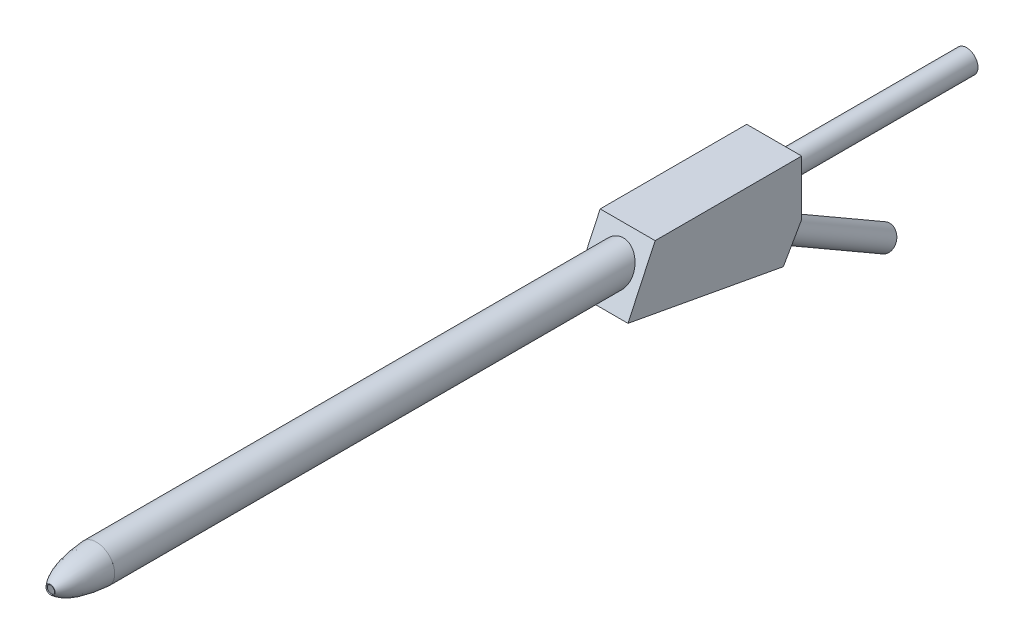
ISO-10303-21;
HEADER;
FILE_DESCRIPTION(('STEP AP214'),'2;1');
FILE_NAME('part.step','',(''),(''),'','','');
FILE_SCHEMA(('AUTOMOTIVE_DESIGN { 1 0 10303 214 1 1 1 1 }'));
ENDSEC;
DATA;
#1=APPLICATION_CONTEXT('core data for automotive mechanical design processes');
#2=APPLICATION_PROTOCOL_DEFINITION('international standard','automotive_design',2000,#1);
#3=PRODUCT_CONTEXT('',#1,'mechanical');
#4=PRODUCT('Part','Part','',(#3));
#5=PRODUCT_RELATED_PRODUCT_CATEGORY('part','',(#4));
#6=PRODUCT_DEFINITION_FORMATION('','',#4);
#7=PRODUCT_DEFINITION_CONTEXT('part definition',#1,'design');
#8=PRODUCT_DEFINITION('design','',#6,#7);
#9=PRODUCT_DEFINITION_SHAPE('','',#8);
#10=(LENGTH_UNIT() NAMED_UNIT(*) SI_UNIT(.MILLI.,.METRE.));
#11=(NAMED_UNIT(*) PLANE_ANGLE_UNIT() SI_UNIT($,.RADIAN.));
#12=(NAMED_UNIT(*) SI_UNIT($,.STERADIAN.) SOLID_ANGLE_UNIT());
#13=UNCERTAINTY_MEASURE_WITH_UNIT(LENGTH_MEASURE(1.E-05),#10,'distance_accuracy_value','');
#14=(GEOMETRIC_REPRESENTATION_CONTEXT(3) GLOBAL_UNCERTAINTY_ASSIGNED_CONTEXT((#13)) GLOBAL_UNIT_ASSIGNED_CONTEXT((#10,
#11,#12)) REPRESENTATION_CONTEXT('',''));
#15=CARTESIAN_POINT('',(0.,0.,0.));
#16=DIRECTION('',(0.,0.,1.));
#17=DIRECTION('',(1.,0.,0.));
#18=AXIS2_PLACEMENT_3D('',#15,#16,#17);
#19=CARTESIAN_POINT('',(3.,-0.999999999999999,58.));
#20=CARTESIAN_POINT('',(3.,-1.21062408025252,61.5822714163661));
#21=CARTESIAN_POINT('',(3.,-2.5,63.));
#22=B_SPLINE_CURVE_WITH_KNOTS('',2,(#19,#20,#21),.UNSPECIFIED.,.F.,.F.,(3,3),(0.,1.),.UNSPECIFIED.);
#23=CARTESIAN_POINT('',(3.,-3.,58.));
#24=DIRECTION('',(0.,0.,-1.));
#25=AXIS1_PLACEMENT('',#23,#24);
#26=SURFACE_OF_REVOLUTION('',#22,#25);
#27=CARTESIAN_POINT('',(3.,-3.,63.));
#28=DIRECTION('',(0.,0.,-1.));
#29=DIRECTION('',(-1.,0.,0.));
#30=AXIS2_PLACEMENT_3D('',#27,#28,#29);
#31=CIRCLE('',#30,0.499999999999995);
#32=CARTESIAN_POINT('',(2.50000000000001,-3.,63.));
#33=VERTEX_POINT('',#32);
#34=EDGE_CURVE('E59',#33,#33,#31,.T.);
#35=ORIENTED_EDGE('',*,*,#34,.T.);
#36=EDGE_LOOP('',(#35));
#37=FACE_BOUND('',#36,.T.);
#38=CARTESIAN_POINT('',(3.,-3.,58.));
#39=DIRECTION('',(0.,0.,-1.));
#40=DIRECTION('',(-1.,0.,0.));
#41=AXIS2_PLACEMENT_3D('',#38,#39,#40);
#42=CIRCLE('',#41,2.);
#43=CARTESIAN_POINT('',(1.,-3.,58.));
#44=VERTEX_POINT('',#43);
#45=EDGE_CURVE('E11',#44,#44,#42,.T.);
#46=ORIENTED_EDGE('',*,*,#45,.F.);
#47=EDGE_LOOP('',(#46));
#48=FACE_BOUND('',#47,.T.);
#49=ADVANCED_FACE('F44',(#37,#48),#26,.F.);
#50=CARTESIAN_POINT('',(3.,-3.,57.9941305129186));
#51=DIRECTION('',(0.,0.,1.));
#52=DIRECTION('',(1.,0.,0.));
#53=AXIS2_PLACEMENT_3D('',#50,#51,#52);
#54=CONICAL_SURFACE('',#53,1.90017240300698,1.51206770212846);
#55=ORIENTED_EDGE('',*,*,#45,.T.);
#56=EDGE_LOOP('',(#55));
#57=FACE_BOUND('',#56,.T.);
#58=CARTESIAN_POINT('',(3.,-3.,57.9941305129186));
#59=DIRECTION('',(0.,0.,-1.));
#60=DIRECTION('',(-1.,0.,0.));
#61=AXIS2_PLACEMENT_3D('',#58,#59,#60);
#62=CIRCLE('',#61,1.90017240300698);
#63=CARTESIAN_POINT('',(1.09982759699302,-3.,57.9941305129186));
#64=VERTEX_POINT('',#63);
#65=EDGE_CURVE('E51',#64,#64,#62,.T.);
#66=ORIENTED_EDGE('',*,*,#65,.F.);
#67=EDGE_LOOP('',(#66));
#68=FACE_BOUND('',#67,.T.);
#69=ADVANCED_FACE('F78',(#57,#68),#54,.T.);
#70=CARTESIAN_POINT('',(3.,-2.573980194543,62.9327175296576));
#71=CARTESIAN_POINT('',(3.,-2.46627954922995,62.8142956784367));
#72=CARTESIAN_POINT('',(3.,-2.27345307077501,62.5684660505644));
#73=CARTESIAN_POINT('',(3.,-1.91662617538266,61.9714709641916));
#74=CARTESIAN_POINT('',(3.,-1.55463473977893,61.0596020998911));
#75=CARTESIAN_POINT('',(3.,-1.29994294852241,59.9117273342673));
#76=CARTESIAN_POINT('',(3.,-1.16370473209703,58.8677243323532));
#77=CARTESIAN_POINT('',(3.,-1.11665394828164,58.2803112629576));
#78=CARTESIAN_POINT('',(3.,-1.09982759699302,57.9941305129186));
#79=B_SPLINE_CURVE_WITH_KNOTS('',3,(#70,#71,#72,#73,#74,#75,#76,#77,#78),.UNSPECIFIED.,.F.,.F.,
(4,1,1,1,1,1,4),(0.,0.125,0.25,0.5,0.75,0.875,1.),.UNSPECIFIED.);
#80=CARTESIAN_POINT('',(3.,-3.,58.));
#81=DIRECTION('',(0.,0.,-1.));
#82=AXIS1_PLACEMENT('',#80,#81);
#83=SURFACE_OF_REVOLUTION('',#79,#82);
#84=ORIENTED_EDGE('',*,*,#65,.T.);
#85=EDGE_LOOP('',(#84));
#86=FACE_BOUND('',#85,.T.);
#87=CARTESIAN_POINT('',(3.,-3.,62.9327175296576));
#88=DIRECTION('',(0.,0.,-1.));
#89=DIRECTION('',(-1.,0.,0.));
#90=AXIS2_PLACEMENT_3D('',#87,#88,#89);
#91=CIRCLE('',#90,0.426019805457004);
#92=CARTESIAN_POINT('',(2.573980194543,-3.,62.9327175296576));
#93=VERTEX_POINT('',#92);
#94=EDGE_CURVE('E55',#93,#93,#91,.T.);
#95=ORIENTED_EDGE('',*,*,#94,.F.);
#96=EDGE_LOOP('',(#95));
#97=FACE_BOUND('',#96,.T.);
#98=ADVANCED_FACE('F74',(#86,#97),#83,.F.);
#99=CARTESIAN_POINT('',(3.,-3.,62.9641776007428));
#100=DIRECTION('',(0.,0.,-1.));
#101=DIRECTION('',(-1.,0.,0.));
#102=AXIS2_PLACEMENT_3D('',#99,#100,#101);
#103=TOROIDAL_SURFACE('',#102,0.464993597267716,0.0500868497791062);
#104=ORIENTED_EDGE('',*,*,#94,.T.);
#105=EDGE_LOOP('',(#104));
#106=FACE_BOUND('',#105,.T.);
#107=ORIENTED_EDGE('',*,*,#34,.F.);
#108=EDGE_LOOP('',(#107));
#109=FACE_BOUND('',#108,.T.);
#110=ADVANCED_FACE('F77',(#106,#109),#103,.T.);
#111=CLOSED_SHELL('',(#49,#69,#98,#110));
#112=MANIFOLD_SOLID_BREP('B2',#111);
#113=CARTESIAN_POINT('',(6.,0.,0.));
#114=DIRECTION('',(0.,-0.423091587311075,-0.906086921187253));
#115=DIRECTION('',(0.,0.906086921187253,-0.423091587311075));
#116=AXIS2_PLACEMENT_3D('',#113,#114,#115);
#117=PLANE('',#116);
#118=CARTESIAN_POINT('',(3.,-3.,1.40083112585941));
#119=DIRECTION('',(0.,-0.423091587311075,-0.906086921187253));
#120=DIRECTION('',(0.,0.906086921187253,-0.423091587311075));
#121=AXIS2_PLACEMENT_3D('',#118,#119,#120);
#122=ELLIPSE('',#121,2.20729375210425,2.);
#123=CARTESIAN_POINT('',(3.,-0.999999999999999,0.466943708619805));
#124=VERTEX_POINT('',#123);
#125=EDGE_CURVE('E210',#124,#124,#122,.F.);
#126=ORIENTED_EDGE('',*,*,#125,.F.);
#127=EDGE_LOOP('',(#126));
#128=FACE_BOUND('',#127,.T.);
#129=DIRECTION('',(0.,-0.906086921187253,0.423091587311075));
#130=VECTOR('',#129,1.);
#131=CARTESIAN_POINT('',(0.,0.,0.));
#132=LINE('',#131,#130);
#133=CARTESIAN_POINT('',(0.,0.,0.));
#134=VERTEX_POINT('',#133);
#135=CARTESIAN_POINT('',(0.,-6.34260844831077,2.96164111117753));
#136=VERTEX_POINT('',#135);
#137=EDGE_CURVE('E195',#134,#136,#132,.T.);
#138=ORIENTED_EDGE('',*,*,#137,.T.);
#139=DIRECTION('',(-1.,0.,0.));
#140=VECTOR('',#139,1.);
#141=CARTESIAN_POINT('',(6.,-6.34260844831077,2.96164111117753));
#142=LINE('',#141,#140);
#143=CARTESIAN_POINT('',(6.,-6.34260844831077,2.96164111117753));
#144=VERTEX_POINT('',#143);
#145=EDGE_CURVE('E208',#144,#136,#142,.T.);
#146=ORIENTED_EDGE('',*,*,#145,.F.);
#147=DIRECTION('',(0.,-0.906086921187253,0.423091587311075));
#148=VECTOR('',#147,1.);
#149=CARTESIAN_POINT('',(6.,0.,0.));
#150=LINE('',#149,#148);
#151=CARTESIAN_POINT('',(6.,0.,0.));
#152=VERTEX_POINT('',#151);
#153=EDGE_CURVE('E204',#152,#144,#150,.T.);
#154=ORIENTED_EDGE('',*,*,#153,.F.);
#155=DIRECTION('',(-1.,0.,0.));
#156=VECTOR('',#155,1.);
#157=CARTESIAN_POINT('',(6.,0.,0.));
#158=LINE('',#157,#156);
#159=EDGE_CURVE('E191',#152,#134,#158,.T.);
#160=ORIENTED_EDGE('',*,*,#159,.T.);
#161=EDGE_LOOP('',(#138,#146,#154,#160));
#162=FACE_BOUND('',#161,.T.);
#163=ADVANCED_FACE('F119',(#128,#162),#117,.F.);
#164=CARTESIAN_POINT('',(6.,-9.46410161513775,-14.));
#165=DIRECTION('',(0.,0.983484368710193,-0.180993084129516));
#166=DIRECTION('',(0.,0.180993084129516,0.983484368710193));
#167=AXIS2_PLACEMENT_3D('',#164,#165,#166);
#168=PLANE('',#167);
#169=DIRECTION('',(0.,-0.180993084129516,-0.983484368710193));
#170=VECTOR('',#169,1.);
#171=CARTESIAN_POINT('',(0.,-9.46410161513775,-14.));
#172=LINE('',#171,#170);
#173=CARTESIAN_POINT('',(0.,-9.46410161513775,-14.));
#174=VERTEX_POINT('',#173);
#175=EDGE_CURVE('E198',#136,#174,#172,.T.);
#176=ORIENTED_EDGE('',*,*,#175,.T.);
#177=DIRECTION('',(-1.,0.,0.));
#178=VECTOR('',#177,1.);
#179=CARTESIAN_POINT('',(6.,-9.46410161513775,-14.));
#180=LINE('',#179,#178);
#181=CARTESIAN_POINT('',(6.,-9.46410161513775,-14.));
#182=VERTEX_POINT('',#181);
#183=EDGE_CURVE('E186',#182,#174,#180,.T.);
#184=ORIENTED_EDGE('',*,*,#183,.F.);
#185=DIRECTION('',(0.,-0.180993084129516,-0.983484368710193));
#186=VECTOR('',#185,1.);
#187=CARTESIAN_POINT('',(6.,-9.46410161513775,-14.));
#188=LINE('',#187,#186);
#189=EDGE_CURVE('E170',#144,#182,#188,.T.);
#190=ORIENTED_EDGE('',*,*,#189,.F.);
#191=ORIENTED_EDGE('',*,*,#145,.T.);
#192=EDGE_LOOP('',(#176,#184,#190,#191));
#193=FACE_BOUND('',#192,.T.);
#194=ADVANCED_FACE('F246',(#193),#168,.F.);
#195=CARTESIAN_POINT('',(6.,-6.,-16.));
#196=DIRECTION('',(0.,0.500000000000001,0.866025403784438));
#197=DIRECTION('',(0.,-0.866025403784438,0.500000000000001));
#198=AXIS2_PLACEMENT_3D('',#195,#196,#197);
#199=PLANE('',#198);
#200=CARTESIAN_POINT('',(3.,-7.73205080756888,-15.));
#201=DIRECTION('',(0.,0.500000000000001,0.866025403784438));
#202=DIRECTION('',(0.,-0.866025403784438,0.500000000000001));
#203=AXIS2_PLACEMENT_3D('',#200,#201,#202);
#204=CIRCLE('',#203,1.25);
#205=CARTESIAN_POINT('',(3.,-8.81458256229943,-14.375));
#206=VERTEX_POINT('',#205);
#207=EDGE_CURVE('E42',#206,#206,#204,.F.);
#208=ORIENTED_EDGE('',*,*,#207,.F.);
#209=EDGE_LOOP('',(#208));
#210=FACE_BOUND('',#209,.T.);
#211=DIRECTION('',(0.,0.866025403784438,-0.500000000000001));
#212=VECTOR('',#211,1.);
#213=CARTESIAN_POINT('',(0.,-6.,-16.));
#214=LINE('',#213,#212);
#215=CARTESIAN_POINT('',(0.,-6.,-16.));
#216=VERTEX_POINT('',#215);
#217=EDGE_CURVE('E185',#174,#216,#214,.T.);
#218=ORIENTED_EDGE('',*,*,#217,.T.);
#219=DIRECTION('',(-1.,0.,0.));
#220=VECTOR('',#219,1.);
#221=CARTESIAN_POINT('',(6.,-6.,-16.));
#222=LINE('',#221,#220);
#223=CARTESIAN_POINT('',(6.,-6.,-16.));
#224=VERTEX_POINT('',#223);
#225=EDGE_CURVE('E182',#224,#216,#222,.T.);
#226=ORIENTED_EDGE('',*,*,#225,.F.);
#227=DIRECTION('',(0.,0.866025403784438,-0.500000000000001));
#228=VECTOR('',#227,1.);
#229=CARTESIAN_POINT('',(6.,-6.,-16.));
#230=LINE('',#229,#228);
#231=EDGE_CURVE('E174',#182,#224,#230,.T.);
#232=ORIENTED_EDGE('',*,*,#231,.F.);
#233=ORIENTED_EDGE('',*,*,#183,.T.);
#234=EDGE_LOOP('',(#218,#226,#232,#233));
#235=FACE_BOUND('',#234,.T.);
#236=ADVANCED_FACE('F183',(#210,#235),#199,.F.);
#237=CARTESIAN_POINT('',(6.,0.,-16.));
#238=DIRECTION('',(0.,0.,1.));
#239=DIRECTION('',(1.,0.,0.));
#240=AXIS2_PLACEMENT_3D('',#237,#238,#239);
#241=PLANE('',#240);
#242=CARTESIAN_POINT('',(3.,-3.,-16.));
#243=DIRECTION('',(0.,0.,1.));
#244=DIRECTION('',(1.,0.,0.));
#245=AXIS2_PLACEMENT_3D('',#242,#243,#244);
#246=CIRCLE('',#245,1.25);
#247=CARTESIAN_POINT('',(4.25,-3.,-16.));
#248=VERTEX_POINT('',#247);
#249=EDGE_CURVE('E216',#248,#248,#246,.T.);
#250=ORIENTED_EDGE('',*,*,#249,.T.);
#251=EDGE_LOOP('',(#250));
#252=FACE_BOUND('',#251,.T.);
#253=DIRECTION('',(0.,1.,0.));
#254=VECTOR('',#253,1.);
#255=CARTESIAN_POINT('',(0.,0.,-16.));
#256=LINE('',#255,#254);
#257=CARTESIAN_POINT('',(0.,0.,-16.));
#258=VERTEX_POINT('',#257);
#259=EDGE_CURVE('E155',#216,#258,#256,.T.);
#260=ORIENTED_EDGE('',*,*,#259,.T.);
#261=DIRECTION('',(-1.,0.,0.));
#262=VECTOR('',#261,1.);
#263=CARTESIAN_POINT('',(6.,0.,-16.));
#264=LINE('',#263,#262);
#265=CARTESIAN_POINT('',(6.,0.,-16.));
#266=VERTEX_POINT('',#265);
#267=EDGE_CURVE('E187',#266,#258,#264,.T.);
#268=ORIENTED_EDGE('',*,*,#267,.F.);
#269=DIRECTION('',(0.,1.,0.));
#270=VECTOR('',#269,1.);
#271=CARTESIAN_POINT('',(6.,0.,-16.));
#272=LINE('',#271,#270);
#273=EDGE_CURVE('E178',#224,#266,#272,.T.);
#274=ORIENTED_EDGE('',*,*,#273,.F.);
#275=ORIENTED_EDGE('',*,*,#225,.T.);
#276=EDGE_LOOP('',(#260,#268,#274,#275));
#277=FACE_BOUND('',#276,.T.);
#278=ADVANCED_FACE('F189',(#252,#277),#241,.F.);
#279=CARTESIAN_POINT('',(6.,0.,0.));
#280=DIRECTION('',(0.,-1.,0.));
#281=DIRECTION('',(0.,0.,-1.));
#282=AXIS2_PLACEMENT_3D('',#279,#280,#281);
#283=PLANE('',#282);
#284=DIRECTION('',(0.,0.,1.));
#285=VECTOR('',#284,1.);
#286=CARTESIAN_POINT('',(0.,0.,0.));
#287=LINE('',#286,#285);
#288=EDGE_CURVE('E161',#258,#134,#287,.T.);
#289=ORIENTED_EDGE('',*,*,#288,.T.);
#290=ORIENTED_EDGE('',*,*,#159,.F.);
#291=DIRECTION('',(0.,0.,1.));
#292=VECTOR('',#291,1.);
#293=CARTESIAN_POINT('',(6.,0.,0.));
#294=LINE('',#293,#292);
#295=EDGE_CURVE('E135',#266,#152,#294,.T.);
#296=ORIENTED_EDGE('',*,*,#295,.F.);
#297=ORIENTED_EDGE('',*,*,#267,.T.);
#298=EDGE_LOOP('',(#289,#290,#296,#297));
#299=FACE_BOUND('',#298,.T.);
#300=ADVANCED_FACE('F243',(#299),#283,.F.);
#301=CARTESIAN_POINT('',(6.,0.,0.));
#302=DIRECTION('',(-1.,0.,0.));
#303=DIRECTION('',(0.,0.,1.));
#304=AXIS2_PLACEMENT_3D('',#301,#302,#303);
#305=PLANE('',#304);
#306=ORIENTED_EDGE('',*,*,#153,.T.);
#307=ORIENTED_EDGE('',*,*,#189,.T.);
#308=ORIENTED_EDGE('',*,*,#231,.T.);
#309=ORIENTED_EDGE('',*,*,#273,.T.);
#310=ORIENTED_EDGE('',*,*,#295,.T.);
#311=EDGE_LOOP('',(#306,#307,#308,#309,#310));
#312=FACE_BOUND('',#311,.T.);
#313=ADVANCED_FACE('F176',(#312),#305,.F.);
#314=CARTESIAN_POINT('',(0.,0.,0.));
#315=DIRECTION('',(-1.,0.,0.));
#316=DIRECTION('',(0.,0.,1.));
#317=AXIS2_PLACEMENT_3D('',#314,#315,#316);
#318=PLANE('',#317);
#319=ORIENTED_EDGE('',*,*,#137,.F.);
#320=ORIENTED_EDGE('',*,*,#288,.F.);
#321=ORIENTED_EDGE('',*,*,#259,.F.);
#322=ORIENTED_EDGE('',*,*,#217,.F.);
#323=ORIENTED_EDGE('',*,*,#175,.F.);
#324=EDGE_LOOP('',(#319,#320,#321,#322,#323));
#325=FACE_BOUND('',#324,.T.);
#326=ADVANCED_FACE('F270',(#325),#318,.T.);
#327=CARTESIAN_POINT('',(3.,-3.,58.));
#328=DIRECTION('',(0.,0.,-1.));
#329=DIRECTION('',(-1.,0.,0.));
#330=AXIS2_PLACEMENT_3D('',#327,#328,#329);
#331=CYLINDRICAL_SURFACE('',#330,1.9);
#332=CARTESIAN_POINT('',(3.,-3.,58.));
#333=DIRECTION('',(0.,0.,1.));
#334=DIRECTION('',(1.,0.,0.));
#335=AXIS2_PLACEMENT_3D('',#332,#333,#334);
#336=CIRCLE('',#335,1.9);
#337=CARTESIAN_POINT('',(4.9,-3.,58.));
#338=VERTEX_POINT('',#337);
#339=EDGE_CURVE('E218',#338,#338,#336,.T.);
#340=ORIENTED_EDGE('',*,*,#339,.T.);
#341=EDGE_LOOP('',(#340));
#342=FACE_BOUND('',#341,.T.);
#343=CARTESIAN_POINT('',(3.,-3.,1.40083112585941));
#344=DIRECTION('',(0.,-0.423091587311075,-0.906086921187253));
#345=DIRECTION('',(0.,0.906086921187253,-0.423091587311075));
#346=AXIS2_PLACEMENT_3D('',#343,#344,#345);
#347=ELLIPSE('',#346,2.09692906449904,1.9);
#348=CARTESIAN_POINT('',(3.,-1.1,0.513638079481785));
#349=VERTEX_POINT('',#348);
#350=EDGE_CURVE('E199',#349,#349,#347,.F.);
#351=ORIENTED_EDGE('',*,*,#350,.F.);
#352=EDGE_LOOP('',(#351));
#353=FACE_BOUND('',#352,.T.);
#354=ADVANCED_FACE('F268',(#342,#353),#331,.F.);
#355=CARTESIAN_POINT('',(3.,-3.,58.));
#356=DIRECTION('',(0.,0.,-1.));
#357=DIRECTION('',(-1.,0.,0.));
#358=AXIS2_PLACEMENT_3D('',#355,#356,#357);
#359=CYLINDRICAL_SURFACE('',#358,2.);
#360=CARTESIAN_POINT('',(3.,-3.,58.));
#361=DIRECTION('',(0.,0.,1.));
#362=DIRECTION('',(1.,0.,0.));
#363=AXIS2_PLACEMENT_3D('',#360,#361,#362);
#364=CIRCLE('',#363,2.);
#365=CARTESIAN_POINT('',(5.,-3.,58.));
#366=VERTEX_POINT('',#365);
#367=EDGE_CURVE('E215',#366,#366,#364,.T.);
#368=ORIENTED_EDGE('',*,*,#367,.F.);
#369=EDGE_LOOP('',(#368));
#370=FACE_BOUND('',#369,.T.);
#371=ORIENTED_EDGE('',*,*,#125,.T.);
#372=EDGE_LOOP('',(#371));
#373=FACE_BOUND('',#372,.T.);
#374=ADVANCED_FACE('F263',(#370,#373),#359,.T.);
#375=CARTESIAN_POINT('',(0.,0.,58.));
#376=DIRECTION('',(0.,0.,1.));
#377=DIRECTION('',(1.,0.,0.));
#378=AXIS2_PLACEMENT_3D('',#375,#376,#377);
#379=PLANE('',#378);
#380=ORIENTED_EDGE('',*,*,#339,.F.);
#381=EDGE_LOOP('',(#380));
#382=FACE_BOUND('',#381,.T.);
#383=ORIENTED_EDGE('',*,*,#367,.T.);
#384=EDGE_LOOP('',(#383));
#385=FACE_BOUND('',#384,.T.);
#386=ADVANCED_FACE('F255',(#382,#385),#379,.T.);
#387=ORIENTED_EDGE('',*,*,#350,.T.);
#388=EDGE_LOOP('',(#387));
#389=FACE_BOUND('',#388,.T.);
#390=ADVANCED_FACE('F248',(#389),#117,.F.);
#391=CARTESIAN_POINT('',(3.,-3.,-37.));
#392=DIRECTION('',(0.,0.,1.));
#393=DIRECTION('',(1.,0.,0.));
#394=AXIS2_PLACEMENT_3D('',#391,#392,#393);
#395=CYLINDRICAL_SURFACE('',#394,1.15);
#396=CARTESIAN_POINT('',(3.,-3.,-37.));
#397=DIRECTION('',(0.,0.,1.));
#398=DIRECTION('',(1.,0.,0.));
#399=AXIS2_PLACEMENT_3D('',#396,#397,#398);
#400=CIRCLE('',#399,1.15);
#401=CARTESIAN_POINT('',(4.15,-3.,-37.));
#402=VERTEX_POINT('',#401);
#403=EDGE_CURVE('E410',#402,#402,#400,.T.);
#404=ORIENTED_EDGE('',*,*,#403,.F.);
#405=EDGE_LOOP('',(#404));
#406=FACE_BOUND('',#405,.T.);
#407=CARTESIAN_POINT('',(3.,-3.,-16.));
#408=DIRECTION('',(0.,0.,1.));
#409=DIRECTION('',(1.,0.,0.));
#410=AXIS2_PLACEMENT_3D('',#407,#408,#409);
#411=CIRCLE('',#410,1.15);
#412=CARTESIAN_POINT('',(4.15,-3.,-16.));
#413=VERTEX_POINT('',#412);
#414=EDGE_CURVE('E127',#413,#413,#411,.T.);
#415=ORIENTED_EDGE('',*,*,#414,.T.);
#416=EDGE_LOOP('',(#415));
#417=FACE_BOUND('',#416,.T.);
#418=ADVANCED_FACE('F223',(#406,#417),#395,.F.);
#419=CARTESIAN_POINT('',(3.,-3.,-37.));
#420=DIRECTION('',(0.,0.,1.));
#421=DIRECTION('',(1.,0.,0.));
#422=AXIS2_PLACEMENT_3D('',#419,#420,#421);
#423=CYLINDRICAL_SURFACE('',#422,1.25);
#424=CARTESIAN_POINT('',(3.,-3.,-37.));
#425=DIRECTION('',(0.,0.,1.));
#426=DIRECTION('',(1.,0.,0.));
#427=AXIS2_PLACEMENT_3D('',#424,#425,#426);
#428=CIRCLE('',#427,1.25);
#429=CARTESIAN_POINT('',(4.25,-3.,-37.));
#430=VERTEX_POINT('',#429);
#431=EDGE_CURVE('E219',#430,#430,#428,.T.);
#432=ORIENTED_EDGE('',*,*,#431,.T.);
#433=EDGE_LOOP('',(#432));
#434=FACE_BOUND('',#433,.T.);
#435=ORIENTED_EDGE('',*,*,#249,.F.);
#436=EDGE_LOOP('',(#435));
#437=FACE_BOUND('',#436,.T.);
#438=ADVANCED_FACE('F237',(#434,#437),#423,.T.);
#439=CARTESIAN_POINT('',(0.,0.,-37.));
#440=DIRECTION('',(0.,0.,1.));
#441=DIRECTION('',(1.,0.,0.));
#442=AXIS2_PLACEMENT_3D('',#439,#440,#441);
#443=PLANE('',#442);
#444=ORIENTED_EDGE('',*,*,#403,.T.);
#445=EDGE_LOOP('',(#444));
#446=FACE_BOUND('',#445,.T.);
#447=ORIENTED_EDGE('',*,*,#431,.F.);
#448=EDGE_LOOP('',(#447));
#449=FACE_BOUND('',#448,.T.);
#450=ADVANCED_FACE('F228',(#446,#449),#443,.F.);
#451=ORIENTED_EDGE('',*,*,#414,.F.);
#452=EDGE_LOOP('',(#451));
#453=FACE_BOUND('',#452,.T.);
#454=ADVANCED_FACE('F225',(#453),#241,.F.);
#455=CARTESIAN_POINT('',(3.,-15.2320508075689,-27.9903810567666));
#456=DIRECTION('',(0.,-0.500000000000001,-0.866025403784438));
#457=DIRECTION('',(0.,0.866025403784438,-0.500000000000001));
#458=AXIS2_PLACEMENT_3D('',#455,#456,#457);
#459=PLANE('',#458);
#460=CARTESIAN_POINT('',(3.,-15.2320508075689,-27.9903810567666));
#461=DIRECTION('',(0.,-0.500000000000001,-0.866025403784438));
#462=DIRECTION('',(0.,0.866025403784438,-0.500000000000001));
#463=AXIS2_PLACEMENT_3D('',#460,#461,#462);
#464=CIRCLE('',#463,1.25);
#465=CARTESIAN_POINT('',(3.,-14.1495190528383,-28.6153810567666));
#466=VERTEX_POINT('',#465);
#467=EDGE_CURVE('E405',#466,#466,#464,.T.);
#468=ORIENTED_EDGE('',*,*,#467,.T.);
#469=EDGE_LOOP('',(#468));
#470=FACE_BOUND('',#469,.T.);
#471=CARTESIAN_POINT('',(3.,-15.2320508075689,-27.9903810567666));
#472=DIRECTION('',(0.,-0.500000000000001,-0.866025403784438));
#473=DIRECTION('',(0.,0.866025403784438,-0.500000000000001));
#474=AXIS2_PLACEMENT_3D('',#471,#472,#473);
#475=CIRCLE('',#474,1.15);
#476=CARTESIAN_POINT('',(3.,-14.2361215932168,-28.5653810567666));
#477=VERTEX_POINT('',#476);
#478=EDGE_CURVE('E402',#477,#477,#475,.T.);
#479=ORIENTED_EDGE('',*,*,#478,.F.);
#480=EDGE_LOOP('',(#479));
#481=FACE_BOUND('',#480,.T.);
#482=ADVANCED_FACE('F227',(#470,#481),#459,.T.);
#483=CARTESIAN_POINT('',(3.,-15.2320508075689,-27.9903810567666));
#484=DIRECTION('',(0.,0.500000000000001,0.866025403784438));
#485=DIRECTION('',(0.,-0.866025403784438,0.500000000000001));
#486=AXIS2_PLACEMENT_3D('',#483,#484,#485);
#487=CYLINDRICAL_SURFACE('',#486,1.25);
#488=ORIENTED_EDGE('',*,*,#467,.F.);
#489=EDGE_LOOP('',(#488));
#490=FACE_BOUND('',#489,.T.);
#491=ORIENTED_EDGE('',*,*,#207,.T.);
#492=EDGE_LOOP('',(#491));
#493=FACE_BOUND('',#492,.T.);
#494=ADVANCED_FACE('F234',(#490,#493),#487,.T.);
#495=CARTESIAN_POINT('',(3.,-15.2320508075689,-27.9903810567666));
#496=DIRECTION('',(0.,0.500000000000001,0.866025403784438));
#497=DIRECTION('',(0.,-0.866025403784438,0.500000000000001));
#498=AXIS2_PLACEMENT_3D('',#495,#496,#497);
#499=CYLINDRICAL_SURFACE('',#498,1.15);
#500=ORIENTED_EDGE('',*,*,#478,.T.);
#501=EDGE_LOOP('',(#500));
#502=FACE_BOUND('',#501,.T.);
#503=CARTESIAN_POINT('',(3.,-7.73205080756888,-15.));
#504=DIRECTION('',(0.,-0.500000000000001,-0.866025403784438));
#505=DIRECTION('',(0.,0.866025403784438,-0.500000000000001));
#506=AXIS2_PLACEMENT_3D('',#503,#504,#505);
#507=CIRCLE('',#506,1.15);
#508=CARTESIAN_POINT('',(3.,-6.73612159321677,-15.575));
#509=VERTEX_POINT('',#508);
#510=EDGE_CURVE('E400',#509,#509,#507,.T.);
#511=ORIENTED_EDGE('',*,*,#510,.F.);
#512=EDGE_LOOP('',(#511));
#513=FACE_BOUND('',#512,.T.);
#514=ADVANCED_FACE('F377',(#502,#513),#499,.F.);
#515=ORIENTED_EDGE('',*,*,#510,.T.);
#516=EDGE_LOOP('',(#515));
#517=FACE_BOUND('',#516,.T.);
#518=ADVANCED_FACE('F363',(#517),#199,.F.);
#519=CLOSED_SHELL('',(#163,#194,#236,#278,#300,#313,#326,#354,#374,#386,#390,#418,#438,#450,
#454,#482,#494,#514,#518));
#520=MANIFOLD_SOLID_BREP('B6',#519);
#521=ADVANCED_BREP_SHAPE_REPRESENTATION('',(#18,#112,#520),#14);
#522=SHAPE_DEFINITION_REPRESENTATION(#9,#521);
ENDSEC;
END-ISO-10303-21;
